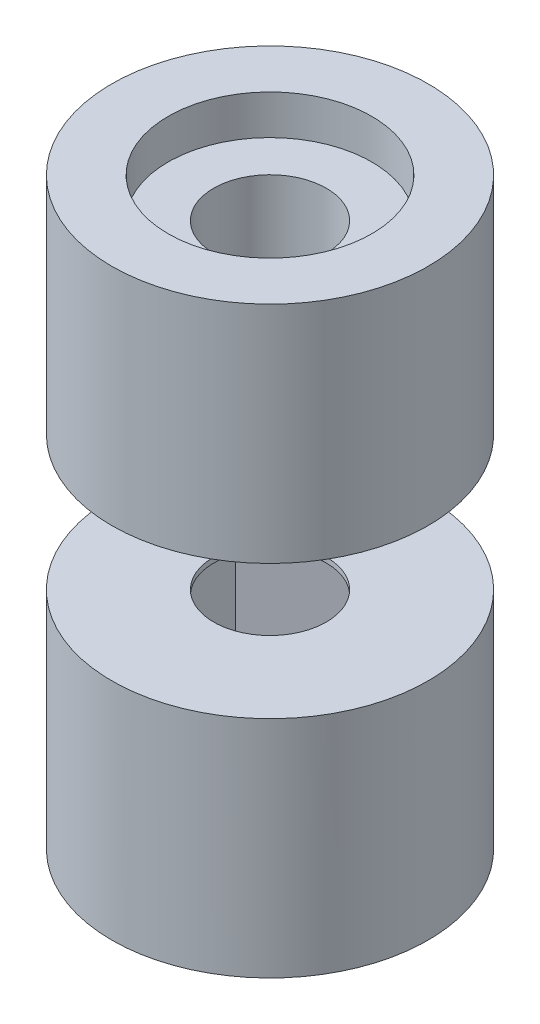
ISO-10303-21;
HEADER;
FILE_DESCRIPTION(('STEP AP214'),'2;1');
FILE_NAME('part.step','',(''),(''),'','','');
FILE_SCHEMA(('AUTOMOTIVE_DESIGN { 1 0 10303 214 1 1 1 1 }'));
ENDSEC;
DATA;
#1=APPLICATION_CONTEXT('core data for automotive mechanical design processes');
#2=APPLICATION_PROTOCOL_DEFINITION('international standard','automotive_design',2000,#1);
#3=PRODUCT_CONTEXT('',#1,'mechanical');
#4=PRODUCT('Part','Part','',(#3));
#5=PRODUCT_RELATED_PRODUCT_CATEGORY('part','',(#4));
#6=PRODUCT_DEFINITION_FORMATION('','',#4);
#7=PRODUCT_DEFINITION_CONTEXT('part definition',#1,'design');
#8=PRODUCT_DEFINITION('design','',#6,#7);
#9=PRODUCT_DEFINITION_SHAPE('','',#8);
#10=(LENGTH_UNIT() NAMED_UNIT(*) SI_UNIT(.MILLI.,.METRE.));
#11=(NAMED_UNIT(*) PLANE_ANGLE_UNIT() SI_UNIT($,.RADIAN.));
#12=(NAMED_UNIT(*) SI_UNIT($,.STERADIAN.) SOLID_ANGLE_UNIT());
#13=UNCERTAINTY_MEASURE_WITH_UNIT(LENGTH_MEASURE(1.E-05),#10,'distance_accuracy_value','');
#14=(GEOMETRIC_REPRESENTATION_CONTEXT(3) GLOBAL_UNCERTAINTY_ASSIGNED_CONTEXT((#13)) GLOBAL_UNIT_ASSIGNED_CONTEXT((#10,
#11,#12)) REPRESENTATION_CONTEXT('',''));
#15=CARTESIAN_POINT('',(0.,0.,0.));
#16=DIRECTION('',(0.,0.,1.));
#17=DIRECTION('',(1.,0.,0.));
#18=AXIS2_PLACEMENT_3D('',#15,#16,#17);
#19=CARTESIAN_POINT('',(0.,29.524,0.));
#20=DIRECTION('',(0.,-1.,0.));
#21=DIRECTION('',(0.,0.,-1.));
#22=AXIS2_PLACEMENT_3D('',#19,#20,#21);
#23=CYLINDRICAL_SURFACE('',#22,2.85);
#24=CARTESIAN_POINT('',(0.,18.162,0.));
#25=DIRECTION('',(0.,1.,0.));
#26=DIRECTION('',(0.,0.,1.));
#27=AXIS2_PLACEMENT_3D('',#24,#25,#26);
#28=CIRCLE('',#27,2.85);
#29=CARTESIAN_POINT('',(0.,18.162,2.85));
#30=VERTEX_POINT('',#29);
#31=EDGE_CURVE('E62',#30,#30,#28,.F.);
#32=ORIENTED_EDGE('',*,*,#31,.T.);
#33=EDGE_LOOP('',(#32));
#34=FACE_BOUND('',#33,.T.);
#35=CARTESIAN_POINT('',(0.,27.524,0.));
#36=DIRECTION('',(0.,1.,0.));
#37=DIRECTION('',(0.,0.,1.));
#38=AXIS2_PLACEMENT_3D('',#35,#36,#37);
#39=CIRCLE('',#38,2.85);
#40=CARTESIAN_POINT('',(0.,27.524,2.85));
#41=VERTEX_POINT('',#40);
#42=EDGE_CURVE('E53',#41,#41,#39,.T.);
#43=ORIENTED_EDGE('',*,*,#42,.T.);
#44=EDGE_LOOP('',(#43));
#45=FACE_BOUND('',#44,.T.);
#46=ADVANCED_FACE('F49',(#34,#45),#23,.F.);
#47=CARTESIAN_POINT('',(0.,29.524,0.));
#48=DIRECTION('',(0.,-1.,0.));
#49=DIRECTION('',(0.,0.,-1.));
#50=AXIS2_PLACEMENT_3D('',#47,#48,#49);
#51=CYLINDRICAL_SURFACE('',#50,8.);
#52=CARTESIAN_POINT('',(0.,29.524,0.));
#53=DIRECTION('',(0.,1.,0.));
#54=DIRECTION('',(0.,0.,1.));
#55=AXIS2_PLACEMENT_3D('',#52,#53,#54);
#56=CIRCLE('',#55,8.);
#57=CARTESIAN_POINT('',(0.,29.524,8.));
#58=VERTEX_POINT('',#57);
#59=EDGE_CURVE('E11',#58,#58,#56,.T.);
#60=ORIENTED_EDGE('',*,*,#59,.F.);
#61=EDGE_LOOP('',(#60));
#62=FACE_BOUND('',#61,.T.);
#63=CARTESIAN_POINT('',(0.,18.162,0.));
#64=DIRECTION('',(0.,1.,0.));
#65=DIRECTION('',(0.,0.,1.));
#66=AXIS2_PLACEMENT_3D('',#63,#64,#65);
#67=CIRCLE('',#66,8.);
#68=CARTESIAN_POINT('',(0.,18.162,8.));
#69=VERTEX_POINT('',#68);
#70=EDGE_CURVE('E57',#69,#69,#67,.T.);
#71=ORIENTED_EDGE('',*,*,#70,.T.);
#72=EDGE_LOOP('',(#71));
#73=FACE_BOUND('',#72,.T.);
#74=ADVANCED_FACE('F51',(#62,#73),#51,.T.);
#75=CARTESIAN_POINT('',(0.,29.524,0.));
#76=DIRECTION('',(0.,1.,0.));
#77=DIRECTION('',(0.,0.,1.));
#78=AXIS2_PLACEMENT_3D('',#75,#76,#77);
#79=PLANE('',#78);
#80=CARTESIAN_POINT('',(0.,29.524,0.));
#81=DIRECTION('',(0.,1.,0.));
#82=DIRECTION('',(0.,0.,1.));
#83=AXIS2_PLACEMENT_3D('',#80,#81,#82);
#84=CIRCLE('',#83,5.15);
#85=CARTESIAN_POINT('',(0.,29.524,5.15));
#86=VERTEX_POINT('',#85);
#87=EDGE_CURVE('E73',#86,#86,#84,.T.);
#88=ORIENTED_EDGE('',*,*,#87,.F.);
#89=EDGE_LOOP('',(#88));
#90=FACE_BOUND('',#89,.T.);
#91=ORIENTED_EDGE('',*,*,#59,.T.);
#92=EDGE_LOOP('',(#91));
#93=FACE_BOUND('',#92,.T.);
#94=ADVANCED_FACE('F82',(#90,#93),#79,.T.);
#95=CARTESIAN_POINT('',(10.2,18.162,-8.));
#96=DIRECTION('',(0.,1.,0.));
#97=DIRECTION('',(0.,0.,1.));
#98=AXIS2_PLACEMENT_3D('',#95,#96,#97);
#99=PLANE('',#98);
#100=ORIENTED_EDGE('',*,*,#31,.F.);
#101=EDGE_LOOP('',(#100));
#102=FACE_BOUND('',#101,.T.);
#103=ORIENTED_EDGE('',*,*,#70,.F.);
#104=EDGE_LOOP('',(#103));
#105=FACE_BOUND('',#104,.T.);
#106=ADVANCED_FACE('F84',(#102,#105),#99,.F.);
#107=CARTESIAN_POINT('',(0.,27.524,0.));
#108=DIRECTION('',(0.,1.,0.));
#109=DIRECTION('',(0.,0.,1.));
#110=AXIS2_PLACEMENT_3D('',#107,#108,#109);
#111=CYLINDRICAL_SURFACE('',#110,5.15);
#112=CARTESIAN_POINT('',(0.,27.524,0.));
#113=DIRECTION('',(0.,1.,0.));
#114=DIRECTION('',(0.,0.,1.));
#115=AXIS2_PLACEMENT_3D('',#112,#113,#114);
#116=CIRCLE('',#115,5.15);
#117=CARTESIAN_POINT('',(0.,27.524,5.15));
#118=VERTEX_POINT('',#117);
#119=EDGE_CURVE('E69',#118,#118,#116,.T.);
#120=ORIENTED_EDGE('',*,*,#119,.F.);
#121=EDGE_LOOP('',(#120));
#122=FACE_BOUND('',#121,.T.);
#123=ORIENTED_EDGE('',*,*,#87,.T.);
#124=EDGE_LOOP('',(#123));
#125=FACE_BOUND('',#124,.T.);
#126=ADVANCED_FACE('F80',(#122,#125),#111,.F.);
#127=CARTESIAN_POINT('',(0.,27.524,0.));
#128=DIRECTION('',(0.,1.,0.));
#129=DIRECTION('',(0.,0.,1.));
#130=AXIS2_PLACEMENT_3D('',#127,#128,#129);
#131=PLANE('',#130);
#132=ORIENTED_EDGE('',*,*,#42,.F.);
#133=EDGE_LOOP('',(#132));
#134=FACE_BOUND('',#133,.T.);
#135=ORIENTED_EDGE('',*,*,#119,.T.);
#136=EDGE_LOOP('',(#135));
#137=FACE_BOUND('',#136,.T.);
#138=ADVANCED_FACE('F99',(#134,#137),#131,.T.);
#139=CLOSED_SHELL('',(#46,#74,#94,#106,#126,#138));
#140=MANIFOLD_SOLID_BREP('B2',#139);
#141=CARTESIAN_POINT('',(0.,0.,0.));
#142=DIRECTION('',(0.,1.,0.));
#143=DIRECTION('',(0.,0.,1.));
#144=AXIS2_PLACEMENT_3D('',#141,#142,#143);
#145=PLANE('',#144);
#146=CARTESIAN_POINT('',(0.,0.,0.));
#147=DIRECTION('',(0.,1.,0.));
#148=DIRECTION('',(0.,0.,1.));
#149=AXIS2_PLACEMENT_3D('',#146,#147,#148);
#150=CIRCLE('',#149,8.);
#151=CARTESIAN_POINT('',(0.,0.,8.));
#152=VERTEX_POINT('',#151);
#153=EDGE_CURVE('E150',#152,#152,#150,.T.);
#154=ORIENTED_EDGE('',*,*,#153,.F.);
#155=EDGE_LOOP('',(#154));
#156=FACE_BOUND('',#155,.T.);
#157=DIRECTION('',(0.,0.,-1.));
#158=VECTOR('',#157,1.);
#159=CARTESIAN_POINT('',(4.1,0.,-2.36713610367746));
#160=LINE('',#159,#158);
#161=CARTESIAN_POINT('',(4.1,0.,2.36713610367747));
#162=VERTEX_POINT('',#161);
#163=CARTESIAN_POINT('',(4.1,0.,-2.36713610367746));
#164=VERTEX_POINT('',#163);
#165=EDGE_CURVE('E158',#162,#164,#160,.T.);
#166=ORIENTED_EDGE('',*,*,#165,.T.);
#167=DIRECTION('',(-0.866025403784439,0.,-0.5));
#168=VECTOR('',#167,1.);
#169=CARTESIAN_POINT('',(0.,0.,-4.73427220735493));
#170=LINE('',#169,#168);
#171=CARTESIAN_POINT('',(0.,0.,-4.73427220735493));
#172=VERTEX_POINT('',#171);
#173=EDGE_CURVE('E229',#164,#172,#170,.T.);
#174=ORIENTED_EDGE('',*,*,#173,.T.);
#175=DIRECTION('',(-0.866025403784438,0.,0.5));
#176=VECTOR('',#175,1.);
#177=CARTESIAN_POINT('',(-4.1,0.,-2.36713610367746));
#178=LINE('',#177,#176);
#179=CARTESIAN_POINT('',(-4.1,0.,-2.36713610367746));
#180=VERTEX_POINT('',#179);
#181=EDGE_CURVE('E232',#172,#180,#178,.T.);
#182=ORIENTED_EDGE('',*,*,#181,.T.);
#183=DIRECTION('',(0.,0.,1.));
#184=VECTOR('',#183,1.);
#185=CARTESIAN_POINT('',(-4.1,0.,2.36713610367747));
#186=LINE('',#185,#184);
#187=CARTESIAN_POINT('',(-4.1,0.,2.36713610367747));
#188=VERTEX_POINT('',#187);
#189=EDGE_CURVE('E235',#180,#188,#186,.T.);
#190=ORIENTED_EDGE('',*,*,#189,.T.);
#191=DIRECTION('',(0.866025403784439,0.,0.5));
#192=VECTOR('',#191,1.);
#193=CARTESIAN_POINT('',(0.,0.,4.73427220735493));
#194=LINE('',#193,#192);
#195=CARTESIAN_POINT('',(0.,0.,4.73427220735493));
#196=VERTEX_POINT('',#195);
#197=EDGE_CURVE('E219',#188,#196,#194,.T.);
#198=ORIENTED_EDGE('',*,*,#197,.T.);
#199=DIRECTION('',(0.866025403784439,0.,-0.5));
#200=VECTOR('',#199,1.);
#201=CARTESIAN_POINT('',(4.1,0.,2.36713610367747));
#202=LINE('',#201,#200);
#203=EDGE_CURVE('E238',#196,#162,#202,.T.);
#204=ORIENTED_EDGE('',*,*,#203,.T.);
#205=EDGE_LOOP('',(#166,#174,#182,#190,#198,#204));
#206=FACE_BOUND('',#205,.T.);
#207=ADVANCED_FACE('F141',(#156,#206),#145,.F.);
#208=CARTESIAN_POINT('',(0.,29.524,0.));
#209=DIRECTION('',(0.,-1.,0.));
#210=DIRECTION('',(0.,0.,-1.));
#211=AXIS2_PLACEMENT_3D('',#208,#209,#210);
#212=CYLINDRICAL_SURFACE('',#211,2.85);
#213=CARTESIAN_POINT('',(0.,11.362,0.));
#214=DIRECTION('',(0.,-1.,0.));
#215=DIRECTION('',(0.,0.,-1.));
#216=AXIS2_PLACEMENT_3D('',#213,#214,#215);
#217=CIRCLE('',#216,2.85);
#218=CARTESIAN_POINT('',(0.,11.362,-2.85));
#219=VERTEX_POINT('',#218);
#220=EDGE_CURVE('E250',#219,#219,#217,.F.);
#221=ORIENTED_EDGE('',*,*,#220,.T.);
#222=EDGE_LOOP('',(#221));
#223=FACE_BOUND('',#222,.T.);
#224=CARTESIAN_POINT('',(0.,11.1,0.));
#225=DIRECTION('',(0.,-1.,0.));
#226=DIRECTION('',(0.,0.,-1.));
#227=AXIS2_PLACEMENT_3D('',#224,#225,#226);
#228=CIRCLE('',#227,2.85);
#229=CARTESIAN_POINT('',(0.,11.1,-2.85));
#230=VERTEX_POINT('',#229);
#231=EDGE_CURVE('E145',#230,#230,#228,.T.);
#232=ORIENTED_EDGE('',*,*,#231,.T.);
#233=EDGE_LOOP('',(#232));
#234=FACE_BOUND('',#233,.T.);
#235=ADVANCED_FACE('F257',(#223,#234),#212,.F.);
#236=CARTESIAN_POINT('',(0.,29.524,0.));
#237=DIRECTION('',(0.,-1.,0.));
#238=DIRECTION('',(0.,0.,-1.));
#239=AXIS2_PLACEMENT_3D('',#236,#237,#238);
#240=CYLINDRICAL_SURFACE('',#239,8.);
#241=CARTESIAN_POINT('',(0.,11.362,0.));
#242=DIRECTION('',(0.,-1.,0.));
#243=DIRECTION('',(0.,0.,-1.));
#244=AXIS2_PLACEMENT_3D('',#241,#242,#243);
#245=CIRCLE('',#244,8.);
#246=CARTESIAN_POINT('',(0.,11.362,-8.));
#247=VERTEX_POINT('',#246);
#248=EDGE_CURVE('E47',#247,#247,#245,.T.);
#249=ORIENTED_EDGE('',*,*,#248,.T.);
#250=EDGE_LOOP('',(#249));
#251=FACE_BOUND('',#250,.T.);
#252=ORIENTED_EDGE('',*,*,#153,.T.);
#253=EDGE_LOOP('',(#252));
#254=FACE_BOUND('',#253,.T.);
#255=ADVANCED_FACE('F143',(#251,#254),#240,.T.);
#256=CARTESIAN_POINT('',(-10.2,11.362,-8.));
#257=DIRECTION('',(0.,-1.,0.));
#258=DIRECTION('',(0.,0.,-1.));
#259=AXIS2_PLACEMENT_3D('',#256,#257,#258);
#260=PLANE('',#259);
#261=ORIENTED_EDGE('',*,*,#220,.F.);
#262=EDGE_LOOP('',(#261));
#263=FACE_BOUND('',#262,.T.);
#264=ORIENTED_EDGE('',*,*,#248,.F.);
#265=EDGE_LOOP('',(#264));
#266=FACE_BOUND('',#265,.T.);
#267=ADVANCED_FACE('F276',(#263,#266),#260,.F.);
#268=CARTESIAN_POINT('',(4.1,11.1,-2.36713610367746));
#269=DIRECTION('',(-1.,0.,0.));
#270=DIRECTION('',(0.,0.,1.));
#271=AXIS2_PLACEMENT_3D('',#268,#269,#270);
#272=PLANE('',#271);
#273=ORIENTED_EDGE('',*,*,#165,.F.);
#274=DIRECTION('',(0.,-1.,0.));
#275=VECTOR('',#274,1.);
#276=CARTESIAN_POINT('',(4.1,11.1,2.36713610367747));
#277=LINE('',#276,#275);
#278=CARTESIAN_POINT('',(4.1,11.1,2.36713610367747));
#279=VERTEX_POINT('',#278);
#280=EDGE_CURVE('E224',#279,#162,#277,.T.);
#281=ORIENTED_EDGE('',*,*,#280,.F.);
#282=DIRECTION('',(0.,0.,-1.));
#283=VECTOR('',#282,1.);
#284=CARTESIAN_POINT('',(4.1,11.1,-2.36713610367746));
#285=LINE('',#284,#283);
#286=CARTESIAN_POINT('',(4.1,11.1,-2.36713610367746));
#287=VERTEX_POINT('',#286);
#288=EDGE_CURVE('E241',#279,#287,#285,.T.);
#289=ORIENTED_EDGE('',*,*,#288,.T.);
#290=DIRECTION('',(0.,-1.,0.));
#291=VECTOR('',#290,1.);
#292=CARTESIAN_POINT('',(4.1,11.1,-2.36713610367746));
#293=LINE('',#292,#291);
#294=EDGE_CURVE('E247',#287,#164,#293,.T.);
#295=ORIENTED_EDGE('',*,*,#294,.T.);
#296=EDGE_LOOP('',(#273,#281,#289,#295));
#297=FACE_BOUND('',#296,.T.);
#298=ADVANCED_FACE('F277',(#297),#272,.T.);
#299=CARTESIAN_POINT('',(0.,11.1,-4.73427220735493));
#300=DIRECTION('',(-0.5,0.,0.866025403784439));
#301=DIRECTION('',(0.866025403784439,0.,0.5));
#302=AXIS2_PLACEMENT_3D('',#299,#300,#301);
#303=PLANE('',#302);
#304=ORIENTED_EDGE('',*,*,#173,.F.);
#305=ORIENTED_EDGE('',*,*,#294,.F.);
#306=DIRECTION('',(-0.866025403784439,0.,-0.5));
#307=VECTOR('',#306,1.);
#308=CARTESIAN_POINT('',(0.,11.1,-4.73427220735493));
#309=LINE('',#308,#307);
#310=CARTESIAN_POINT('',(0.,11.1,-4.73427220735493));
#311=VERTEX_POINT('',#310);
#312=EDGE_CURVE('E197',#287,#311,#309,.T.);
#313=ORIENTED_EDGE('',*,*,#312,.T.);
#314=DIRECTION('',(0.,-1.,0.));
#315=VECTOR('',#314,1.);
#316=CARTESIAN_POINT('',(0.,11.1,-4.73427220735493));
#317=LINE('',#316,#315);
#318=EDGE_CURVE('E245',#311,#172,#317,.T.);
#319=ORIENTED_EDGE('',*,*,#318,.T.);
#320=EDGE_LOOP('',(#304,#305,#313,#319));
#321=FACE_BOUND('',#320,.T.);
#322=ADVANCED_FACE('F282',(#321),#303,.T.);
#323=CARTESIAN_POINT('',(-4.1,11.1,-2.36713610367746));
#324=DIRECTION('',(0.5,0.,0.866025403784438));
#325=DIRECTION('',(0.866025403784439,0.,-0.5));
#326=AXIS2_PLACEMENT_3D('',#323,#324,#325);
#327=PLANE('',#326);
#328=ORIENTED_EDGE('',*,*,#181,.F.);
#329=ORIENTED_EDGE('',*,*,#318,.F.);
#330=DIRECTION('',(-0.866025403784438,0.,0.5));
#331=VECTOR('',#330,1.);
#332=CARTESIAN_POINT('',(-4.1,11.1,-2.36713610367746));
#333=LINE('',#332,#331);
#334=CARTESIAN_POINT('',(-4.1,11.1,-2.36713610367746));
#335=VERTEX_POINT('',#334);
#336=EDGE_CURVE('E215',#311,#335,#333,.T.);
#337=ORIENTED_EDGE('',*,*,#336,.T.);
#338=DIRECTION('',(0.,-1.,0.));
#339=VECTOR('',#338,1.);
#340=CARTESIAN_POINT('',(-4.1,11.1,-2.36713610367746));
#341=LINE('',#340,#339);
#342=EDGE_CURVE('E212',#335,#180,#341,.T.);
#343=ORIENTED_EDGE('',*,*,#342,.T.);
#344=EDGE_LOOP('',(#328,#329,#337,#343));
#345=FACE_BOUND('',#344,.T.);
#346=ADVANCED_FACE('F285',(#345),#327,.T.);
#347=CARTESIAN_POINT('',(-4.1,11.1,2.36713610367747));
#348=DIRECTION('',(1.,0.,0.));
#349=DIRECTION('',(0.,0.,-1.));
#350=AXIS2_PLACEMENT_3D('',#347,#348,#349);
#351=PLANE('',#350);
#352=ORIENTED_EDGE('',*,*,#189,.F.);
#353=ORIENTED_EDGE('',*,*,#342,.F.);
#354=DIRECTION('',(0.,0.,1.));
#355=VECTOR('',#354,1.);
#356=CARTESIAN_POINT('',(-4.1,11.1,2.36713610367747));
#357=LINE('',#356,#355);
#358=CARTESIAN_POINT('',(-4.1,11.1,2.36713610367747));
#359=VERTEX_POINT('',#358);
#360=EDGE_CURVE('E207',#335,#359,#357,.T.);
#361=ORIENTED_EDGE('',*,*,#360,.T.);
#362=DIRECTION('',(0.,-1.,0.));
#363=VECTOR('',#362,1.);
#364=CARTESIAN_POINT('',(-4.1,11.1,2.36713610367747));
#365=LINE('',#364,#363);
#366=EDGE_CURVE('E211',#359,#188,#365,.T.);
#367=ORIENTED_EDGE('',*,*,#366,.T.);
#368=EDGE_LOOP('',(#352,#353,#361,#367));
#369=FACE_BOUND('',#368,.T.);
#370=ADVANCED_FACE('F210',(#369),#351,.T.);
#371=CARTESIAN_POINT('',(0.,11.1,4.73427220735493));
#372=DIRECTION('',(0.5,0.,-0.866025403784439));
#373=DIRECTION('',(-0.866025403784439,0.,-0.5));
#374=AXIS2_PLACEMENT_3D('',#371,#372,#373);
#375=PLANE('',#374);
#376=ORIENTED_EDGE('',*,*,#197,.F.);
#377=ORIENTED_EDGE('',*,*,#366,.F.);
#378=DIRECTION('',(0.866025403784439,0.,0.5));
#379=VECTOR('',#378,1.);
#380=CARTESIAN_POINT('',(0.,11.1,4.73427220735493));
#381=LINE('',#380,#379);
#382=CARTESIAN_POINT('',(0.,11.1,4.73427220735493));
#383=VERTEX_POINT('',#382);
#384=EDGE_CURVE('E214',#359,#383,#381,.T.);
#385=ORIENTED_EDGE('',*,*,#384,.T.);
#386=DIRECTION('',(0.,-1.,0.));
#387=VECTOR('',#386,1.);
#388=CARTESIAN_POINT('',(0.,11.1,4.73427220735493));
#389=LINE('',#388,#387);
#390=EDGE_CURVE('E188',#383,#196,#389,.T.);
#391=ORIENTED_EDGE('',*,*,#390,.T.);
#392=EDGE_LOOP('',(#376,#377,#385,#391));
#393=FACE_BOUND('',#392,.T.);
#394=ADVANCED_FACE('F217',(#393),#375,.T.);
#395=CARTESIAN_POINT('',(4.1,11.1,2.36713610367747));
#396=DIRECTION('',(-0.5,0.,-0.866025403784439));
#397=DIRECTION('',(-0.866025403784439,0.,0.5));
#398=AXIS2_PLACEMENT_3D('',#395,#396,#397);
#399=PLANE('',#398);
#400=ORIENTED_EDGE('',*,*,#203,.F.);
#401=ORIENTED_EDGE('',*,*,#390,.F.);
#402=DIRECTION('',(0.866025403784439,0.,-0.5));
#403=VECTOR('',#402,1.);
#404=CARTESIAN_POINT('',(4.1,11.1,2.36713610367747));
#405=LINE('',#404,#403);
#406=EDGE_CURVE('E166',#383,#279,#405,.T.);
#407=ORIENTED_EDGE('',*,*,#406,.T.);
#408=ORIENTED_EDGE('',*,*,#280,.T.);
#409=EDGE_LOOP('',(#400,#401,#407,#408));
#410=FACE_BOUND('',#409,.T.);
#411=ADVANCED_FACE('F260',(#410),#399,.T.);
#412=CARTESIAN_POINT('',(0.,11.1,0.));
#413=DIRECTION('',(0.,-1.,0.));
#414=DIRECTION('',(0.,0.,-1.));
#415=AXIS2_PLACEMENT_3D('',#412,#413,#414);
#416=PLANE('',#415);
#417=ORIENTED_EDGE('',*,*,#231,.F.);
#418=EDGE_LOOP('',(#417));
#419=FACE_BOUND('',#418,.T.);
#420=ORIENTED_EDGE('',*,*,#288,.F.);
#421=ORIENTED_EDGE('',*,*,#406,.F.);
#422=ORIENTED_EDGE('',*,*,#384,.F.);
#423=ORIENTED_EDGE('',*,*,#360,.F.);
#424=ORIENTED_EDGE('',*,*,#336,.F.);
#425=ORIENTED_EDGE('',*,*,#312,.F.);
#426=EDGE_LOOP('',(#420,#421,#422,#423,#424,#425));
#427=FACE_BOUND('',#426,.T.);
#428=ADVANCED_FACE('F222',(#419,#427),#416,.T.);
#429=CLOSED_SHELL('',(#207,#235,#255,#267,#298,#322,#346,#370,#394,#411,#428));
#430=MANIFOLD_SOLID_BREP('B6',#429);
#431=ADVANCED_BREP_SHAPE_REPRESENTATION('',(#18,#140,#430),#14);
#432=SHAPE_DEFINITION_REPRESENTATION(#9,#431);
ENDSEC;
END-ISO-10303-21;
